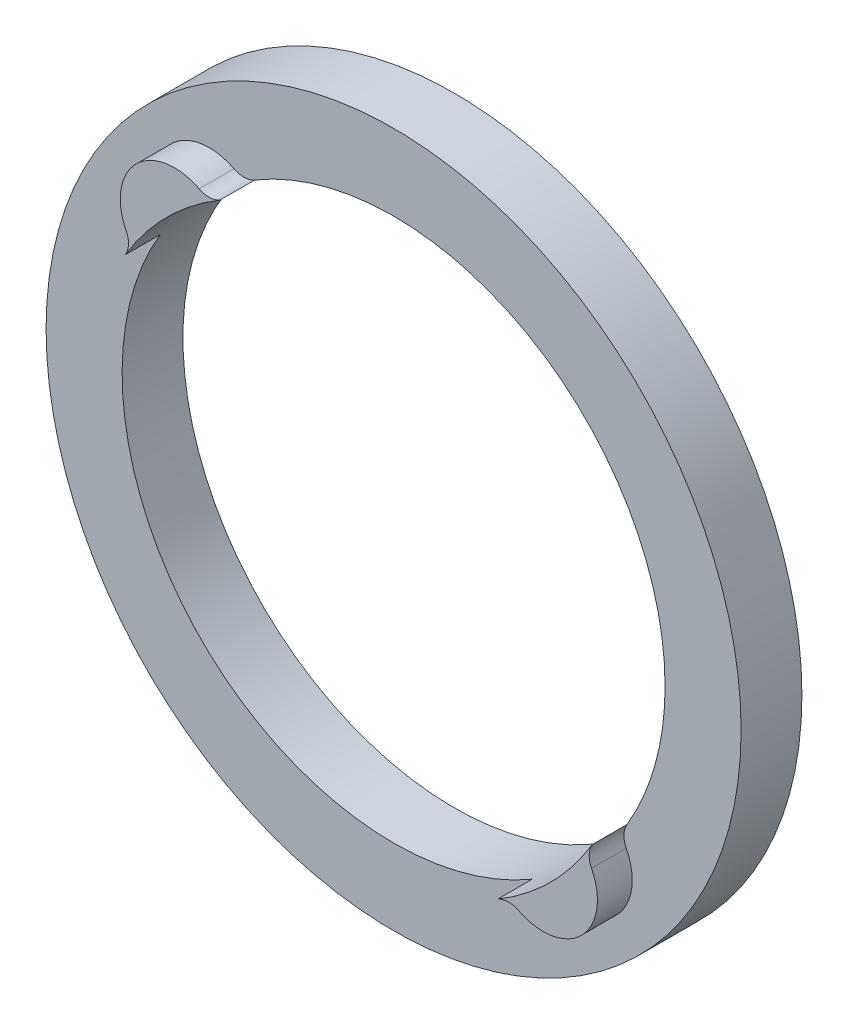
ISO-10303-21;
HEADER;
FILE_DESCRIPTION(('STEP AP214'),'2;1');
FILE_NAME('part.step','',(''),(''),'','','');
FILE_SCHEMA(('AUTOMOTIVE_DESIGN { 1 0 10303 214 1 1 1 1 }'));
ENDSEC;
DATA;
#1=APPLICATION_CONTEXT('core data for automotive mechanical design processes');
#2=APPLICATION_PROTOCOL_DEFINITION('international standard','automotive_design',2000,#1);
#3=PRODUCT_CONTEXT('',#1,'mechanical');
#4=PRODUCT('Part','Part','',(#3));
#5=PRODUCT_RELATED_PRODUCT_CATEGORY('part','',(#4));
#6=PRODUCT_DEFINITION_FORMATION('','',#4);
#7=PRODUCT_DEFINITION_CONTEXT('part definition',#1,'design');
#8=PRODUCT_DEFINITION('design','',#6,#7);
#9=PRODUCT_DEFINITION_SHAPE('','',#8);
#10=(LENGTH_UNIT() NAMED_UNIT(*) SI_UNIT(.MILLI.,.METRE.));
#11=(NAMED_UNIT(*) PLANE_ANGLE_UNIT() SI_UNIT($,.RADIAN.));
#12=(NAMED_UNIT(*) SI_UNIT($,.STERADIAN.) SOLID_ANGLE_UNIT());
#13=UNCERTAINTY_MEASURE_WITH_UNIT(LENGTH_MEASURE(1.E-05),#10,'distance_accuracy_value','');
#14=(GEOMETRIC_REPRESENTATION_CONTEXT(3) GLOBAL_UNCERTAINTY_ASSIGNED_CONTEXT((#13)) GLOBAL_UNIT_ASSIGNED_CONTEXT((#10,
#11,#12)) REPRESENTATION_CONTEXT('',''));
#15=CARTESIAN_POINT('',(0.,0.,0.));
#16=DIRECTION('',(0.,0.,1.));
#17=DIRECTION('',(1.,0.,0.));
#18=AXIS2_PLACEMENT_3D('',#15,#16,#17);
#19=CARTESIAN_POINT('',(0.,0.,1.6));
#20=DIRECTION('',(0.,0.,1.));
#21=DIRECTION('',(1.,0.,0.));
#22=AXIS2_PLACEMENT_3D('',#19,#20,#21);
#23=PLANE('',#22);
#24=CARTESIAN_POINT('',(0.,0.,1.6));
#25=DIRECTION('',(0.,0.,-1.));
#26=DIRECTION('',(-1.,0.,0.));
#27=AXIS2_PLACEMENT_3D('',#24,#25,#26);
#28=CIRCLE('',#27,12.5);
#29=CARTESIAN_POINT('',(12.5,0.,1.6));
#30=VERTEX_POINT('',#29);
#31=EDGE_CURVE('E44',#30,#30,#28,.T.);
#32=ORIENTED_EDGE('',*,*,#31,.F.);
#33=EDGE_LOOP('',(#32));
#34=FACE_BOUND('',#33,.T.);
#35=CARTESIAN_POINT('',(0.,0.,1.6));
#36=DIRECTION('',(0.,0.,1.));
#37=DIRECTION('',(-1.,0.,0.));
#38=AXIS2_PLACEMENT_3D('',#35,#36,#37);
#39=CIRCLE('',#38,16.);
#40=CARTESIAN_POINT('',(16.,0.,1.6));
#41=VERTEX_POINT('',#40);
#42=EDGE_CURVE('E11',#41,#41,#39,.T.);
#43=ORIENTED_EDGE('',*,*,#42,.F.);
#44=EDGE_LOOP('',(#43));
#45=FACE_BOUND('',#44,.T.);
#46=ADVANCED_FACE('F17',(#34,#45),#23,.F.);
#47=CARTESIAN_POINT('',(0.,0.,1.6));
#48=DIRECTION('',(0.,0.,1.));
#49=DIRECTION('',(-1.,0.,0.));
#50=AXIS2_PLACEMENT_3D('',#47,#48,#49);
#51=CYLINDRICAL_SURFACE('',#50,16.);
#52=CARTESIAN_POINT('',(0.,0.,4.4));
#53=DIRECTION('',(0.,0.,1.));
#54=DIRECTION('',(-1.,0.,0.));
#55=AXIS2_PLACEMENT_3D('',#52,#53,#54);
#56=CIRCLE('',#55,16.);
#57=CARTESIAN_POINT('',(16.,0.,4.4));
#58=VERTEX_POINT('',#57);
#59=EDGE_CURVE('E130',#58,#58,#56,.T.);
#60=ORIENTED_EDGE('',*,*,#59,.F.);
#61=DIRECTION('',(0.,0.,-1.));
#62=VECTOR('',#61,1.);
#63=CARTESIAN_POINT('',(16.,0.,1.6));
#64=LINE('',#63,#62);
#65=EDGE_CURVE('E25',#58,#41,#64,.T.);
#66=ORIENTED_EDGE('',*,*,#65,.T.);
#67=ORIENTED_EDGE('',*,*,#42,.T.);
#68=ORIENTED_EDGE('',*,*,#65,.F.);
#69=EDGE_LOOP('',(#60,#66,#67,#68));
#70=FACE_BOUND('',#69,.T.);
#71=ADVANCED_FACE('F228',(#70),#51,.T.);
#72=CARTESIAN_POINT('',(0.,0.,1.6));
#73=DIRECTION('',(0.,0.,1.));
#74=DIRECTION('',(-1.,0.,0.));
#75=AXIS2_PLACEMENT_3D('',#72,#73,#74);
#76=CYLINDRICAL_SURFACE('',#75,12.5);
#77=CARTESIAN_POINT('',(0.,0.,4.4));
#78=DIRECTION('',(0.,0.,-1.));
#79=DIRECTION('',(-1.,0.,0.));
#80=AXIS2_PLACEMENT_3D('',#77,#78,#79);
#81=CIRCLE('',#80,12.5);
#82=CARTESIAN_POINT('',(6.38701559825623,-10.7450468471585,4.4));
#83=VERTEX_POINT('',#82);
#84=CARTESIAN_POINT('',(-10.7450468471585,6.38701559825624,4.4));
#85=VERTEX_POINT('',#84);
#86=EDGE_CURVE('E195',#83,#85,#81,.T.);
#87=ORIENTED_EDGE('',*,*,#86,.F.);
#88=DIRECTION('',(0.,0.,1.));
#89=VECTOR('',#88,1.);
#90=CARTESIAN_POINT('',(6.38701559825623,-10.7450468471585,4.4));
#91=LINE('',#90,#89);
#92=CARTESIAN_POINT('',(6.38701559825623,-10.7450468471585,6.));
#93=VERTEX_POINT('',#92);
#94=EDGE_CURVE('E215',#83,#93,#91,.T.);
#95=ORIENTED_EDGE('',*,*,#94,.T.);
#96=CARTESIAN_POINT('',(0.,0.,6.));
#97=DIRECTION('',(0.,0.,-1.));
#98=DIRECTION('',(-1.,0.,0.));
#99=AXIS2_PLACEMENT_3D('',#96,#97,#98);
#100=CIRCLE('',#99,12.5);
#101=CARTESIAN_POINT('',(10.7450468471585,-6.38701559825625,6.));
#102=VERTEX_POINT('',#101);
#103=EDGE_CURVE('E219',#102,#93,#100,.T.);
#104=ORIENTED_EDGE('',*,*,#103,.F.);
#105=DIRECTION('',(0.,0.,1.));
#106=VECTOR('',#105,1.);
#107=CARTESIAN_POINT('',(10.7450468471585,-6.38701559825625,4.4));
#108=LINE('',#107,#106);
#109=CARTESIAN_POINT('',(10.7450468471585,-6.38701559825625,4.4));
#110=VERTEX_POINT('',#109);
#111=EDGE_CURVE('E198',#110,#102,#108,.T.);
#112=ORIENTED_EDGE('',*,*,#111,.F.);
#113=CARTESIAN_POINT('',(0.,0.,4.4));
#114=DIRECTION('',(0.,0.,-1.));
#115=DIRECTION('',(-1.,0.,0.));
#116=AXIS2_PLACEMENT_3D('',#113,#114,#115);
#117=CIRCLE('',#116,12.5);
#118=CARTESIAN_POINT('',(12.5,0.,4.4));
#119=VERTEX_POINT('',#118);
#120=EDGE_CURVE('E129',#119,#110,#117,.T.);
#121=ORIENTED_EDGE('',*,*,#120,.F.);
#122=DIRECTION('',(0.,0.,-1.));
#123=VECTOR('',#122,1.);
#124=CARTESIAN_POINT('',(12.5,0.,1.6));
#125=LINE('',#124,#123);
#126=EDGE_CURVE('E123',#119,#30,#125,.T.);
#127=ORIENTED_EDGE('',*,*,#126,.T.);
#128=ORIENTED_EDGE('',*,*,#31,.T.);
#129=ORIENTED_EDGE('',*,*,#126,.F.);
#130=CARTESIAN_POINT('',(0.,0.,4.4));
#131=DIRECTION('',(0.,0.,-1.));
#132=DIRECTION('',(-1.,0.,0.));
#133=AXIS2_PLACEMENT_3D('',#130,#131,#132);
#134=CIRCLE('',#133,12.5);
#135=CARTESIAN_POINT('',(-6.38701559825623,10.7450468471585,4.4));
#136=VERTEX_POINT('',#135);
#137=EDGE_CURVE('E117',#136,#119,#134,.T.);
#138=ORIENTED_EDGE('',*,*,#137,.F.);
#139=DIRECTION('',(0.,0.,1.));
#140=VECTOR('',#139,1.);
#141=CARTESIAN_POINT('',(-6.38701559825623,10.7450468471585,4.4));
#142=LINE('',#141,#140);
#143=CARTESIAN_POINT('',(-6.38701559825623,10.7450468471585,6.));
#144=VERTEX_POINT('',#143);
#145=EDGE_CURVE('E121',#136,#144,#142,.T.);
#146=ORIENTED_EDGE('',*,*,#145,.T.);
#147=CARTESIAN_POINT('',(0.,0.,6.));
#148=DIRECTION('',(0.,0.,-1.));
#149=DIRECTION('',(-1.,0.,0.));
#150=AXIS2_PLACEMENT_3D('',#147,#148,#149);
#151=CIRCLE('',#150,12.5);
#152=CARTESIAN_POINT('',(-10.7450468471585,6.38701559825624,6.));
#153=VERTEX_POINT('',#152);
#154=EDGE_CURVE('E139',#153,#144,#151,.T.);
#155=ORIENTED_EDGE('',*,*,#154,.F.);
#156=DIRECTION('',(0.,0.,1.));
#157=VECTOR('',#156,1.);
#158=CARTESIAN_POINT('',(-10.7450468471585,6.38701559825624,4.4));
#159=LINE('',#158,#157);
#160=EDGE_CURVE('E157',#85,#153,#159,.T.);
#161=ORIENTED_EDGE('',*,*,#160,.F.);
#162=EDGE_LOOP('',(#87,#95,#104,#112,#121,#127,#128,#129,#138,#146,#155,#161));
#163=FACE_BOUND('',#162,.T.);
#164=ADVANCED_FACE('F120',(#163),#76,.F.);
#165=CARTESIAN_POINT('',(0.,0.,6.));
#166=DIRECTION('',(0.,0.,1.));
#167=DIRECTION('',(1.,0.,0.));
#168=AXIS2_PLACEMENT_3D('',#165,#166,#167);
#169=PLANE('',#168);
#170=CARTESIAN_POINT('',(6.89797684611675,-11.6046505949312,6.));
#171=DIRECTION('',(0.,0.,-1.));
#172=DIRECTION('',(0.453515579463366,0.891248348769302,0.));
#173=AXIS2_PLACEMENT_3D('',#170,#171,#172);
#174=CIRCLE('',#173,1.00000000000003);
#175=CARTESIAN_POINT('',(7.35149242558012,-10.7134022461619,6.));
#176=VERTEX_POINT('',#175);
#177=EDGE_CURVE('E212',#93,#176,#174,.T.);
#178=ORIENTED_EDGE('',*,*,#177,.T.);
#179=CARTESIAN_POINT('',(8.48528137423857,-8.48528137423857,6.));
#180=DIRECTION('',(0.,0.,1.));
#181=DIRECTION('',(-0.632851685854859,-0.77427304209217,0.));
#182=AXIS2_PLACEMENT_3D('',#179,#180,#181);
#183=CIRCLE('',#182,2.5);
#184=CARTESIAN_POINT('',(10.7134022461619,-7.35149242558011,6.));
#185=VERTEX_POINT('',#184);
#186=EDGE_CURVE('E173',#176,#185,#183,.T.);
#187=ORIENTED_EDGE('',*,*,#186,.T.);
#188=CARTESIAN_POINT('',(11.6046505949312,-6.89797684611674,6.));
#189=DIRECTION('',(0.,0.,-1.));
#190=DIRECTION('',(-0.859603747772685,0.510961247860495,0.));
#191=AXIS2_PLACEMENT_3D('',#188,#189,#190);
#192=CIRCLE('',#191,1.);
#193=EDGE_CURVE('E202',#185,#102,#192,.T.);
#194=ORIENTED_EDGE('',*,*,#193,.T.);
#195=ORIENTED_EDGE('',*,*,#103,.T.);
#196=EDGE_LOOP('',(#178,#187,#194,#195));
#197=FACE_BOUND('',#196,.T.);
#198=ADVANCED_FACE('F328',(#197),#169,.T.);
#199=CARTESIAN_POINT('',(6.89797684611675,-11.6046505949312,4.4));
#200=DIRECTION('',(0.,0.,1.));
#201=DIRECTION('',(0.453515579463366,0.891248348769302,0.));
#202=AXIS2_PLACEMENT_3D('',#199,#200,#201);
#203=CYLINDRICAL_SURFACE('',#202,1.00000000000003);
#204=CARTESIAN_POINT('',(6.89797684611675,-11.6046505949312,4.4));
#205=DIRECTION('',(0.,0.,1.));
#206=DIRECTION('',(0.453515579463366,0.891248348769302,0.));
#207=AXIS2_PLACEMENT_3D('',#204,#205,#206);
#208=CIRCLE('',#207,1.00000000000003);
#209=CARTESIAN_POINT('',(7.35149242558012,-10.7134022461619,4.4));
#210=VERTEX_POINT('',#209);
#211=EDGE_CURVE('E191',#210,#83,#208,.T.);
#212=ORIENTED_EDGE('',*,*,#211,.F.);
#213=DIRECTION('',(0.,0.,1.));
#214=VECTOR('',#213,1.);
#215=CARTESIAN_POINT('',(7.35149242558012,-10.7134022461619,4.4));
#216=LINE('',#215,#214);
#217=EDGE_CURVE('E176',#210,#176,#216,.T.);
#218=ORIENTED_EDGE('',*,*,#217,.T.);
#219=ORIENTED_EDGE('',*,*,#177,.F.);
#220=ORIENTED_EDGE('',*,*,#94,.F.);
#221=EDGE_LOOP('',(#212,#218,#219,#220));
#222=FACE_BOUND('',#221,.T.);
#223=ADVANCED_FACE('F259',(#222),#203,.F.);
#224=CARTESIAN_POINT('',(8.48528137423857,-8.48528137423857,4.4));
#225=DIRECTION('',(0.,0.,1.));
#226=DIRECTION('',(-0.632851685854859,-0.77427304209217,0.));
#227=AXIS2_PLACEMENT_3D('',#224,#225,#226);
#228=CYLINDRICAL_SURFACE('',#227,2.5);
#229=CARTESIAN_POINT('',(8.48528137423857,-8.48528137423857,4.4));
#230=DIRECTION('',(0.,0.,-1.));
#231=DIRECTION('',(-0.632851685854859,-0.77427304209217,0.));
#232=AXIS2_PLACEMENT_3D('',#229,#230,#231);
#233=CIRCLE('',#232,2.5);
#234=CARTESIAN_POINT('',(10.7134022461619,-7.35149242558011,4.4));
#235=VERTEX_POINT('',#234);
#236=EDGE_CURVE('E187',#235,#210,#233,.T.);
#237=ORIENTED_EDGE('',*,*,#236,.F.);
#238=DIRECTION('',(0.,0.,1.));
#239=VECTOR('',#238,1.);
#240=CARTESIAN_POINT('',(10.7134022461619,-7.35149242558011,4.4));
#241=LINE('',#240,#239);
#242=EDGE_CURVE('E177',#235,#185,#241,.T.);
#243=ORIENTED_EDGE('',*,*,#242,.T.);
#244=ORIENTED_EDGE('',*,*,#186,.F.);
#245=ORIENTED_EDGE('',*,*,#217,.F.);
#246=EDGE_LOOP('',(#237,#243,#244,#245));
#247=FACE_BOUND('',#246,.T.);
#248=ADVANCED_FACE('F240',(#247),#228,.T.);
#249=CARTESIAN_POINT('',(11.6046505949312,-6.89797684611674,4.4));
#250=DIRECTION('',(0.,0.,1.));
#251=DIRECTION('',(-0.859603747772685,0.510961247860495,0.));
#252=AXIS2_PLACEMENT_3D('',#249,#250,#251);
#253=CYLINDRICAL_SURFACE('',#252,1.);
#254=CARTESIAN_POINT('',(11.6046505949312,-6.89797684611674,4.4));
#255=DIRECTION('',(0.,0.,1.));
#256=DIRECTION('',(-0.859603747772685,0.510961247860495,0.));
#257=AXIS2_PLACEMENT_3D('',#254,#255,#256);
#258=CIRCLE('',#257,1.);
#259=EDGE_CURVE('E183',#110,#235,#258,.T.);
#260=ORIENTED_EDGE('',*,*,#259,.F.);
#261=ORIENTED_EDGE('',*,*,#111,.T.);
#262=ORIENTED_EDGE('',*,*,#193,.F.);
#263=ORIENTED_EDGE('',*,*,#242,.F.);
#264=EDGE_LOOP('',(#260,#261,#262,#263));
#265=FACE_BOUND('',#264,.T.);
#266=ADVANCED_FACE('F231',(#265),#253,.F.);
#267=CARTESIAN_POINT('',(0.,0.,4.4));
#268=DIRECTION('',(0.,0.,1.));
#269=DIRECTION('',(1.,0.,0.));
#270=AXIS2_PLACEMENT_3D('',#267,#268,#269);
#271=PLANE('',#270);
#272=CARTESIAN_POINT('',(-11.6046505949312,6.89797684611674,4.4));
#273=DIRECTION('',(0.,0.,1.));
#274=DIRECTION('',(0.859603747772683,-0.510961247860499,0.));
#275=AXIS2_PLACEMENT_3D('',#272,#273,#274);
#276=CIRCLE('',#275,1.);
#277=CARTESIAN_POINT('',(-10.7134022461619,7.35149242558011,4.4));
#278=VERTEX_POINT('',#277);
#279=EDGE_CURVE('E262',#85,#278,#276,.T.);
#280=ORIENTED_EDGE('',*,*,#279,.T.);
#281=CARTESIAN_POINT('',(-8.48528137423857,8.48528137423857,4.4));
#282=DIRECTION('',(0.,0.,-1.));
#283=DIRECTION('',(0.632851685854859,0.77427304209217,0.));
#284=AXIS2_PLACEMENT_3D('',#281,#282,#283);
#285=CIRCLE('',#284,2.5);
#286=CARTESIAN_POINT('',(-7.35149242558012,10.7134022461619,4.4));
#287=VERTEX_POINT('',#286);
#288=EDGE_CURVE('E145',#278,#287,#285,.T.);
#289=ORIENTED_EDGE('',*,*,#288,.T.);
#290=CARTESIAN_POINT('',(-6.89797684611674,11.6046505949312,4.4));
#291=DIRECTION('',(0.,0.,1.));
#292=DIRECTION('',(-0.453515579463367,-0.891248348769302,0.));
#293=AXIS2_PLACEMENT_3D('',#290,#291,#292);
#294=CIRCLE('',#293,1.00000000000003);
#295=EDGE_CURVE('E135',#287,#136,#294,.T.);
#296=ORIENTED_EDGE('',*,*,#295,.T.);
#297=ORIENTED_EDGE('',*,*,#137,.T.);
#298=ORIENTED_EDGE('',*,*,#120,.T.);
#299=ORIENTED_EDGE('',*,*,#259,.T.);
#300=ORIENTED_EDGE('',*,*,#236,.T.);
#301=ORIENTED_EDGE('',*,*,#211,.T.);
#302=ORIENTED_EDGE('',*,*,#86,.T.);
#303=EDGE_LOOP('',(#280,#289,#296,#297,#298,#299,#300,#301,#302));
#304=FACE_BOUND('',#303,.T.);
#305=ORIENTED_EDGE('',*,*,#59,.T.);
#306=EDGE_LOOP('',(#305));
#307=FACE_BOUND('',#306,.T.);
#308=ADVANCED_FACE('F143',(#304,#307),#271,.T.);
#309=CARTESIAN_POINT('',(0.,0.,6.));
#310=DIRECTION('',(0.,0.,1.));
#311=DIRECTION('',(1.,0.,0.));
#312=AXIS2_PLACEMENT_3D('',#309,#310,#311);
#313=PLANE('',#312);
#314=CARTESIAN_POINT('',(-6.89797684611674,11.6046505949312,6.));
#315=DIRECTION('',(0.,0.,-1.));
#316=DIRECTION('',(-0.453515579463367,-0.891248348769302,0.));
#317=AXIS2_PLACEMENT_3D('',#314,#315,#316);
#318=CIRCLE('',#317,1.00000000000003);
#319=CARTESIAN_POINT('',(-7.35149242558012,10.7134022461619,6.));
#320=VERTEX_POINT('',#319);
#321=EDGE_CURVE('E137',#144,#320,#318,.T.);
#322=ORIENTED_EDGE('',*,*,#321,.T.);
#323=CARTESIAN_POINT('',(-8.48528137423857,8.48528137423857,6.));
#324=DIRECTION('',(0.,0.,1.));
#325=DIRECTION('',(0.632851685854859,0.77427304209217,0.));
#326=AXIS2_PLACEMENT_3D('',#323,#324,#325);
#327=CIRCLE('',#326,2.5);
#328=CARTESIAN_POINT('',(-10.7134022461619,7.35149242558011,6.));
#329=VERTEX_POINT('',#328);
#330=EDGE_CURVE('E154',#320,#329,#327,.T.);
#331=ORIENTED_EDGE('',*,*,#330,.T.);
#332=CARTESIAN_POINT('',(-11.6046505949312,6.89797684611674,6.));
#333=DIRECTION('',(0.,0.,-1.));
#334=DIRECTION('',(0.859603747772683,-0.510961247860499,0.));
#335=AXIS2_PLACEMENT_3D('',#332,#333,#334);
#336=CIRCLE('',#335,1.);
#337=EDGE_CURVE('E159',#329,#153,#336,.T.);
#338=ORIENTED_EDGE('',*,*,#337,.T.);
#339=ORIENTED_EDGE('',*,*,#154,.T.);
#340=EDGE_LOOP('',(#322,#331,#338,#339));
#341=FACE_BOUND('',#340,.T.);
#342=ADVANCED_FACE('F230',(#341),#313,.T.);
#343=CARTESIAN_POINT('',(-6.89797684611674,11.6046505949312,4.4));
#344=DIRECTION('',(0.,0.,1.));
#345=DIRECTION('',(-0.453515579463367,-0.891248348769302,0.));
#346=AXIS2_PLACEMENT_3D('',#343,#344,#345);
#347=CYLINDRICAL_SURFACE('',#346,1.00000000000003);
#348=ORIENTED_EDGE('',*,*,#295,.F.);
#349=DIRECTION('',(0.,0.,1.));
#350=VECTOR('',#349,1.);
#351=CARTESIAN_POINT('',(-7.35149242558012,10.7134022461619,4.4));
#352=LINE('',#351,#350);
#353=EDGE_CURVE('E147',#287,#320,#352,.T.);
#354=ORIENTED_EDGE('',*,*,#353,.T.);
#355=ORIENTED_EDGE('',*,*,#321,.F.);
#356=ORIENTED_EDGE('',*,*,#145,.F.);
#357=EDGE_LOOP('',(#348,#354,#355,#356));
#358=FACE_BOUND('',#357,.T.);
#359=ADVANCED_FACE('F133',(#358),#347,.F.);
#360=CARTESIAN_POINT('',(-8.48528137423857,8.48528137423857,4.4));
#361=DIRECTION('',(0.,0.,1.));
#362=DIRECTION('',(0.632851685854859,0.77427304209217,0.));
#363=AXIS2_PLACEMENT_3D('',#360,#361,#362);
#364=CYLINDRICAL_SURFACE('',#363,2.5);
#365=ORIENTED_EDGE('',*,*,#288,.F.);
#366=DIRECTION('',(0.,0.,1.));
#367=VECTOR('',#366,1.);
#368=CARTESIAN_POINT('',(-10.7134022461619,7.35149242558011,4.4));
#369=LINE('',#368,#367);
#370=EDGE_CURVE('E163',#278,#329,#369,.T.);
#371=ORIENTED_EDGE('',*,*,#370,.T.);
#372=ORIENTED_EDGE('',*,*,#330,.F.);
#373=ORIENTED_EDGE('',*,*,#353,.F.);
#374=EDGE_LOOP('',(#365,#371,#372,#373));
#375=FACE_BOUND('',#374,.T.);
#376=ADVANCED_FACE('F277',(#375),#364,.T.);
#377=CARTESIAN_POINT('',(-11.6046505949312,6.89797684611674,4.4));
#378=DIRECTION('',(0.,0.,1.));
#379=DIRECTION('',(0.859603747772683,-0.510961247860499,0.));
#380=AXIS2_PLACEMENT_3D('',#377,#378,#379);
#381=CYLINDRICAL_SURFACE('',#380,1.);
#382=ORIENTED_EDGE('',*,*,#279,.F.);
#383=ORIENTED_EDGE('',*,*,#160,.T.);
#384=ORIENTED_EDGE('',*,*,#337,.F.);
#385=ORIENTED_EDGE('',*,*,#370,.F.);
#386=EDGE_LOOP('',(#382,#383,#384,#385));
#387=FACE_BOUND('',#386,.T.);
#388=ADVANCED_FACE('F267',(#387),#381,.F.);
#389=CLOSED_SHELL('',(#46,#71,#164,#198,#223,#248,#266,#308,#342,#359,#376,#388));
#390=MANIFOLD_SOLID_BREP('B1',#389);
#391=ADVANCED_BREP_SHAPE_REPRESENTATION('',(#18,#390),#14);
#392=SHAPE_DEFINITION_REPRESENTATION(#9,#391);
ENDSEC;
END-ISO-10303-21;
